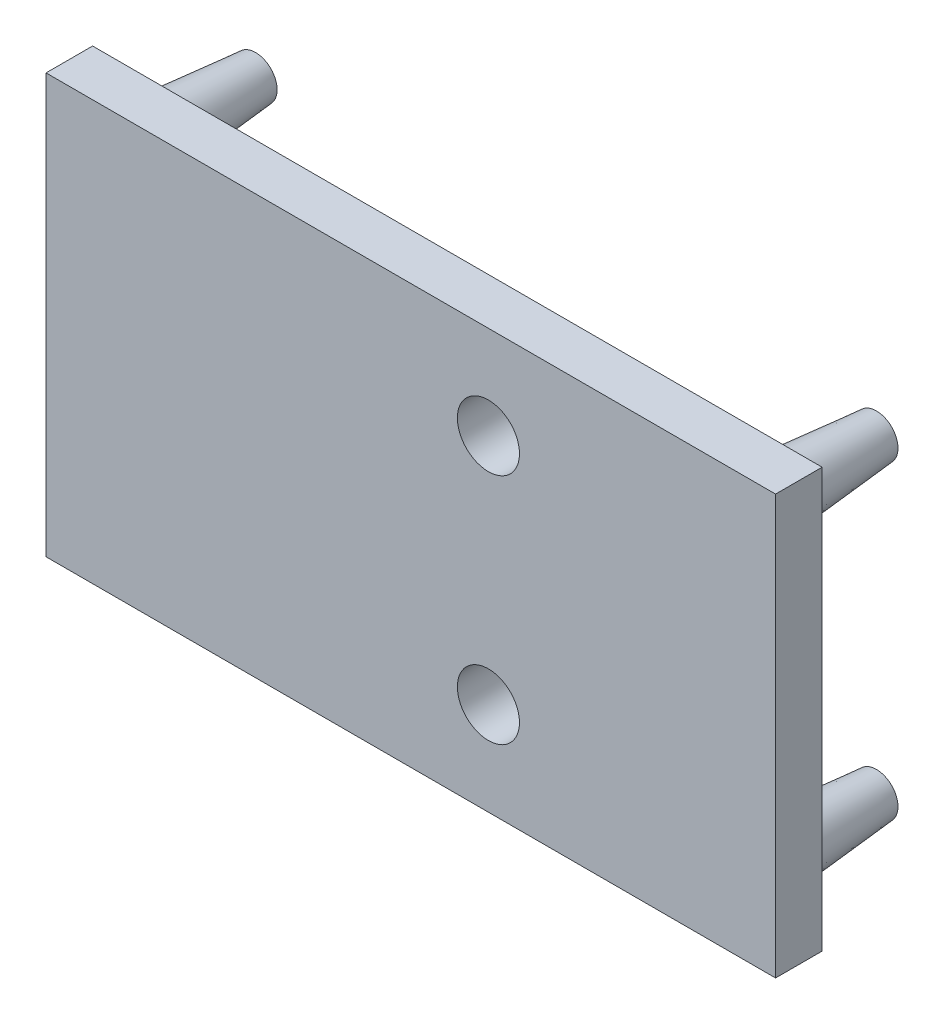
ISO-10303-21;
HEADER;
FILE_DESCRIPTION(('STEP AP214'),'2;1');
FILE_NAME('part.step','',(''),(''),'','','');
FILE_SCHEMA(('AUTOMOTIVE_DESIGN { 1 0 10303 214 1 1 1 1 }'));
ENDSEC;
DATA;
#1=APPLICATION_CONTEXT('core data for automotive mechanical design processes');
#2=APPLICATION_PROTOCOL_DEFINITION('international standard','automotive_design',2000,#1);
#3=PRODUCT_CONTEXT('',#1,'mechanical');
#4=PRODUCT('Part','Part','',(#3));
#5=PRODUCT_RELATED_PRODUCT_CATEGORY('part','',(#4));
#6=PRODUCT_DEFINITION_FORMATION('','',#4);
#7=PRODUCT_DEFINITION_CONTEXT('part definition',#1,'design');
#8=PRODUCT_DEFINITION('design','',#6,#7);
#9=PRODUCT_DEFINITION_SHAPE('','',#8);
#10=(LENGTH_UNIT() NAMED_UNIT(*) SI_UNIT(.MILLI.,.METRE.));
#11=(NAMED_UNIT(*) PLANE_ANGLE_UNIT() SI_UNIT($,.RADIAN.));
#12=(NAMED_UNIT(*) SI_UNIT($,.STERADIAN.) SOLID_ANGLE_UNIT());
#13=UNCERTAINTY_MEASURE_WITH_UNIT(LENGTH_MEASURE(1.E-05),#10,'distance_accuracy_value','');
#14=(GEOMETRIC_REPRESENTATION_CONTEXT(3) GLOBAL_UNCERTAINTY_ASSIGNED_CONTEXT((#13)) GLOBAL_UNIT_ASSIGNED_CONTEXT((#10,
#11,#12)) REPRESENTATION_CONTEXT('',''));
#15=CARTESIAN_POINT('',(0.,0.,0.));
#16=DIRECTION('',(0.,0.,1.));
#17=DIRECTION('',(1.,0.,0.));
#18=AXIS2_PLACEMENT_3D('',#15,#16,#17);
#19=CARTESIAN_POINT('',(-23.5,13.5,3.));
#20=DIRECTION('',(0.,1.,0.));
#21=DIRECTION('',(0.,0.,1.));
#22=AXIS2_PLACEMENT_3D('',#19,#20,#21);
#23=PLANE('',#22);
#24=DIRECTION('',(1.,0.,0.));
#25=VECTOR('',#24,1.);
#26=CARTESIAN_POINT('',(-23.5,13.5,0.));
#27=LINE('',#26,#25);
#28=CARTESIAN_POINT('',(-23.5,13.5,0.));
#29=VERTEX_POINT('',#28);
#30=CARTESIAN_POINT('',(23.5,13.5,0.));
#31=VERTEX_POINT('',#30);
#32=EDGE_CURVE('E107',#29,#31,#27,.T.);
#33=ORIENTED_EDGE('',*,*,#32,.F.);
#34=DIRECTION('',(0.,0.,-1.));
#35=VECTOR('',#34,1.);
#36=CARTESIAN_POINT('',(-23.5,13.5,3.));
#37=LINE('',#36,#35);
#38=CARTESIAN_POINT('',(-23.5,13.5,3.));
#39=VERTEX_POINT('',#38);
#40=EDGE_CURVE('E55',#39,#29,#37,.T.);
#41=ORIENTED_EDGE('',*,*,#40,.F.);
#42=DIRECTION('',(1.,0.,0.));
#43=VECTOR('',#42,1.);
#44=CARTESIAN_POINT('',(-23.5,13.5,3.));
#45=LINE('',#44,#43);
#46=CARTESIAN_POINT('',(23.5,13.5,3.));
#47=VERTEX_POINT('',#46);
#48=EDGE_CURVE('E100',#39,#47,#45,.T.);
#49=ORIENTED_EDGE('',*,*,#48,.T.);
#50=DIRECTION('',(0.,0.,-1.));
#51=VECTOR('',#50,1.);
#52=CARTESIAN_POINT('',(23.5,13.5,3.));
#53=LINE('',#52,#51);
#54=EDGE_CURVE('E97',#47,#31,#53,.T.);
#55=ORIENTED_EDGE('',*,*,#54,.T.);
#56=EDGE_LOOP('',(#33,#41,#49,#55));
#57=FACE_BOUND('',#56,.T.);
#58=ADVANCED_FACE('F37',(#57),#23,.T.);
#59=CARTESIAN_POINT('',(-23.5,-13.5,3.));
#60=DIRECTION('',(-1.,0.,0.));
#61=DIRECTION('',(0.,0.,1.));
#62=AXIS2_PLACEMENT_3D('',#59,#60,#61);
#63=PLANE('',#62);
#64=DIRECTION('',(0.,1.,0.));
#65=VECTOR('',#64,1.);
#66=CARTESIAN_POINT('',(-23.5,-13.5,0.));
#67=LINE('',#66,#65);
#68=CARTESIAN_POINT('',(-23.5,-13.5,0.));
#69=VERTEX_POINT('',#68);
#70=EDGE_CURVE('E102',#69,#29,#67,.T.);
#71=ORIENTED_EDGE('',*,*,#70,.F.);
#72=DIRECTION('',(0.,0.,-1.));
#73=VECTOR('',#72,1.);
#74=CARTESIAN_POINT('',(-23.5,-13.5,3.));
#75=LINE('',#74,#73);
#76=CARTESIAN_POINT('',(-23.5,-13.5,3.));
#77=VERTEX_POINT('',#76);
#78=EDGE_CURVE('E71',#77,#69,#75,.T.);
#79=ORIENTED_EDGE('',*,*,#78,.F.);
#80=DIRECTION('',(0.,1.,0.));
#81=VECTOR('',#80,1.);
#82=CARTESIAN_POINT('',(-23.5,-13.5,3.));
#83=LINE('',#82,#81);
#84=EDGE_CURVE('E88',#77,#39,#83,.T.);
#85=ORIENTED_EDGE('',*,*,#84,.T.);
#86=ORIENTED_EDGE('',*,*,#40,.T.);
#87=EDGE_LOOP('',(#71,#79,#85,#86));
#88=FACE_BOUND('',#87,.T.);
#89=ADVANCED_FACE('F164',(#88),#63,.T.);
#90=CARTESIAN_POINT('',(-23.5,-13.5,3.));
#91=DIRECTION('',(0.,1.,0.));
#92=DIRECTION('',(0.,0.,1.));
#93=AXIS2_PLACEMENT_3D('',#90,#91,#92);
#94=PLANE('',#93);
#95=DIRECTION('',(1.,0.,0.));
#96=VECTOR('',#95,1.);
#97=CARTESIAN_POINT('',(-23.5,-13.5,0.));
#98=LINE('',#97,#96);
#99=CARTESIAN_POINT('',(23.5,-13.5,0.));
#100=VERTEX_POINT('',#99);
#101=EDGE_CURVE('E93',#69,#100,#98,.T.);
#102=ORIENTED_EDGE('',*,*,#101,.T.);
#103=DIRECTION('',(0.,0.,-1.));
#104=VECTOR('',#103,1.);
#105=CARTESIAN_POINT('',(23.5,-13.5,3.));
#106=LINE('',#105,#104);
#107=CARTESIAN_POINT('',(23.5,-13.5,3.));
#108=VERTEX_POINT('',#107);
#109=EDGE_CURVE('E91',#108,#100,#106,.T.);
#110=ORIENTED_EDGE('',*,*,#109,.F.);
#111=DIRECTION('',(1.,0.,0.));
#112=VECTOR('',#111,1.);
#113=CARTESIAN_POINT('',(-23.5,-13.5,3.));
#114=LINE('',#113,#112);
#115=EDGE_CURVE('E85',#77,#108,#114,.T.);
#116=ORIENTED_EDGE('',*,*,#115,.F.);
#117=ORIENTED_EDGE('',*,*,#78,.T.);
#118=EDGE_LOOP('',(#102,#110,#116,#117));
#119=FACE_BOUND('',#118,.T.);
#120=ADVANCED_FACE('F92',(#119),#94,.F.);
#121=CARTESIAN_POINT('',(23.5,-13.5,3.));
#122=DIRECTION('',(-1.,0.,0.));
#123=DIRECTION('',(0.,0.,1.));
#124=AXIS2_PLACEMENT_3D('',#121,#122,#123);
#125=PLANE('',#124);
#126=DIRECTION('',(0.,1.,0.));
#127=VECTOR('',#126,1.);
#128=CARTESIAN_POINT('',(23.5,-13.5,0.));
#129=LINE('',#128,#127);
#130=EDGE_CURVE('E110',#100,#31,#129,.T.);
#131=ORIENTED_EDGE('',*,*,#130,.T.);
#132=ORIENTED_EDGE('',*,*,#54,.F.);
#133=DIRECTION('',(0.,1.,0.));
#134=VECTOR('',#133,1.);
#135=CARTESIAN_POINT('',(23.5,-13.5,3.));
#136=LINE('',#135,#134);
#137=EDGE_CURVE('E82',#108,#47,#136,.T.);
#138=ORIENTED_EDGE('',*,*,#137,.F.);
#139=ORIENTED_EDGE('',*,*,#109,.T.);
#140=EDGE_LOOP('',(#131,#132,#138,#139));
#141=FACE_BOUND('',#140,.T.);
#142=ADVANCED_FACE('F99',(#141),#125,.F.);
#143=CARTESIAN_POINT('',(0.,0.,3.));
#144=DIRECTION('',(0.,0.,1.));
#145=DIRECTION('',(1.,0.,0.));
#146=AXIS2_PLACEMENT_3D('',#143,#144,#145);
#147=PLANE('',#146);
#148=CARTESIAN_POINT('',(5.,7.5,3.));
#149=DIRECTION('',(0.,0.,1.));
#150=DIRECTION('',(1.,0.,0.));
#151=AXIS2_PLACEMENT_3D('',#148,#149,#150);
#152=CIRCLE('',#151,2.);
#153=CARTESIAN_POINT('',(7.,7.5,3.));
#154=VERTEX_POINT('',#153);
#155=EDGE_CURVE('E128',#154,#154,#152,.T.);
#156=ORIENTED_EDGE('',*,*,#155,.F.);
#157=EDGE_LOOP('',(#156));
#158=FACE_BOUND('',#157,.T.);
#159=CARTESIAN_POINT('',(5.,-7.5,3.));
#160=DIRECTION('',(0.,0.,1.));
#161=DIRECTION('',(1.,0.,0.));
#162=AXIS2_PLACEMENT_3D('',#159,#160,#161);
#163=CIRCLE('',#162,2.);
#164=CARTESIAN_POINT('',(7.,-7.5,3.));
#165=VERTEX_POINT('',#164);
#166=EDGE_CURVE('E134',#165,#165,#163,.T.);
#167=ORIENTED_EDGE('',*,*,#166,.F.);
#168=EDGE_LOOP('',(#167));
#169=FACE_BOUND('',#168,.T.);
#170=ORIENTED_EDGE('',*,*,#48,.F.);
#171=ORIENTED_EDGE('',*,*,#84,.F.);
#172=ORIENTED_EDGE('',*,*,#115,.T.);
#173=ORIENTED_EDGE('',*,*,#137,.T.);
#174=EDGE_LOOP('',(#170,#171,#172,#173));
#175=FACE_BOUND('',#174,.T.);
#176=ADVANCED_FACE('F87',(#158,#169,#175),#147,.T.);
#177=CARTESIAN_POINT('',(0.,0.,0.));
#178=DIRECTION('',(0.,0.,1.));
#179=DIRECTION('',(1.,0.,0.));
#180=AXIS2_PLACEMENT_3D('',#177,#178,#179);
#181=PLANE('',#180);
#182=CARTESIAN_POINT('',(5.,7.5,0.));
#183=DIRECTION('',(0.,0.,1.));
#184=DIRECTION('',(1.,0.,0.));
#185=AXIS2_PLACEMENT_3D('',#182,#183,#184);
#186=CIRCLE('',#185,2.);
#187=CARTESIAN_POINT('',(7.,7.5,0.));
#188=VERTEX_POINT('',#187);
#189=EDGE_CURVE('E40',#188,#188,#186,.T.);
#190=ORIENTED_EDGE('',*,*,#189,.T.);
#191=EDGE_LOOP('',(#190));
#192=FACE_BOUND('',#191,.T.);
#193=CARTESIAN_POINT('',(5.,-7.5,0.));
#194=DIRECTION('',(0.,0.,1.));
#195=DIRECTION('',(1.,0.,0.));
#196=AXIS2_PLACEMENT_3D('',#193,#194,#195);
#197=CIRCLE('',#196,2.);
#198=CARTESIAN_POINT('',(7.,-7.5,0.));
#199=VERTEX_POINT('',#198);
#200=EDGE_CURVE('E126',#199,#199,#197,.T.);
#201=ORIENTED_EDGE('',*,*,#200,.T.);
#202=EDGE_LOOP('',(#201));
#203=FACE_BOUND('',#202,.T.);
#204=CARTESIAN_POINT('',(-20.,10.,0.));
#205=DIRECTION('',(0.,0.,1.));
#206=DIRECTION('',(1.,0.,0.));
#207=AXIS2_PLACEMENT_3D('',#204,#205,#206);
#208=CIRCLE('',#207,2.);
#209=CARTESIAN_POINT('',(-18.,10.,0.));
#210=VERTEX_POINT('',#209);
#211=EDGE_CURVE('E11',#210,#210,#208,.F.);
#212=ORIENTED_EDGE('',*,*,#211,.F.);
#213=EDGE_LOOP('',(#212));
#214=FACE_BOUND('',#213,.T.);
#215=CARTESIAN_POINT('',(-20.,-10.,0.));
#216=DIRECTION('',(0.,0.,1.));
#217=DIRECTION('',(1.,0.,0.));
#218=AXIS2_PLACEMENT_3D('',#215,#216,#217);
#219=CIRCLE('',#218,2.);
#220=CARTESIAN_POINT('',(-18.,-10.,0.));
#221=VERTEX_POINT('',#220);
#222=EDGE_CURVE('E46',#221,#221,#219,.F.);
#223=ORIENTED_EDGE('',*,*,#222,.F.);
#224=EDGE_LOOP('',(#223));
#225=FACE_BOUND('',#224,.T.);
#226=CARTESIAN_POINT('',(20.,-10.,0.));
#227=DIRECTION('',(0.,0.,1.));
#228=DIRECTION('',(1.,0.,0.));
#229=AXIS2_PLACEMENT_3D('',#226,#227,#228);
#230=CIRCLE('',#229,2.);
#231=CARTESIAN_POINT('',(22.,-10.,0.));
#232=VERTEX_POINT('',#231);
#233=EDGE_CURVE('E122',#232,#232,#230,.F.);
#234=ORIENTED_EDGE('',*,*,#233,.F.);
#235=EDGE_LOOP('',(#234));
#236=FACE_BOUND('',#235,.T.);
#237=CARTESIAN_POINT('',(20.,10.,0.));
#238=DIRECTION('',(0.,0.,1.));
#239=DIRECTION('',(1.,0.,0.));
#240=AXIS2_PLACEMENT_3D('',#237,#238,#239);
#241=CIRCLE('',#240,2.);
#242=CARTESIAN_POINT('',(22.,10.,0.));
#243=VERTEX_POINT('',#242);
#244=EDGE_CURVE('E117',#243,#243,#241,.F.);
#245=ORIENTED_EDGE('',*,*,#244,.F.);
#246=EDGE_LOOP('',(#245));
#247=FACE_BOUND('',#246,.T.);
#248=ORIENTED_EDGE('',*,*,#32,.T.);
#249=ORIENTED_EDGE('',*,*,#130,.F.);
#250=ORIENTED_EDGE('',*,*,#101,.F.);
#251=ORIENTED_EDGE('',*,*,#70,.T.);
#252=EDGE_LOOP('',(#248,#249,#250,#251));
#253=FACE_BOUND('',#252,.T.);
#254=ADVANCED_FACE('F156',(#192,#203,#214,#225,#236,#247,#253),#181,.F.);
#255=CARTESIAN_POINT('',(20.,10.,0.));
#256=DIRECTION('',(0.,0.,1.));
#257=DIRECTION('',(-1.,0.,0.));
#258=AXIS2_PLACEMENT_3D('',#255,#256,#257);
#259=CONICAL_SURFACE('',#258,2.,0.0872664625997167);
#260=CARTESIAN_POINT('',(20.,10.,-7.));
#261=DIRECTION('',(0.,0.,-1.));
#262=DIRECTION('',(-1.,0.,0.));
#263=AXIS2_PLACEMENT_3D('',#260,#261,#262);
#264=CIRCLE('',#263,1.38757935531853);
#265=CARTESIAN_POINT('',(18.6124206446815,10.,-7.));
#266=VERTEX_POINT('',#265);
#267=EDGE_CURVE('E111',#266,#266,#264,.T.);
#268=ORIENTED_EDGE('',*,*,#267,.F.);
#269=EDGE_LOOP('',(#268));
#270=FACE_BOUND('',#269,.T.);
#271=ORIENTED_EDGE('',*,*,#244,.T.);
#272=EDGE_LOOP('',(#271));
#273=FACE_BOUND('',#272,.T.);
#274=ADVANCED_FACE('F153',(#270,#273),#259,.T.);
#275=CARTESIAN_POINT('',(20.,10.,-7.));
#276=DIRECTION('',(0.,0.,-1.));
#277=DIRECTION('',(-1.,0.,0.));
#278=AXIS2_PLACEMENT_3D('',#275,#276,#277);
#279=PLANE('',#278);
#280=ORIENTED_EDGE('',*,*,#267,.T.);
#281=EDGE_LOOP('',(#280));
#282=FACE_BOUND('',#281,.T.);
#283=ADVANCED_FACE('F151',(#282),#279,.T.);
#284=CARTESIAN_POINT('',(20.,-10.,0.));
#285=DIRECTION('',(0.,0.,1.));
#286=DIRECTION('',(-1.,0.,0.));
#287=AXIS2_PLACEMENT_3D('',#284,#285,#286);
#288=CONICAL_SURFACE('',#287,2.,0.0872664625997167);
#289=CARTESIAN_POINT('',(20.,-10.,-7.));
#290=DIRECTION('',(0.,0.,-1.));
#291=DIRECTION('',(-1.,0.,0.));
#292=AXIS2_PLACEMENT_3D('',#289,#290,#291);
#293=CIRCLE('',#292,1.38757935531853);
#294=CARTESIAN_POINT('',(18.6124206446815,-10.,-7.));
#295=VERTEX_POINT('',#294);
#296=EDGE_CURVE('E146',#295,#295,#293,.T.);
#297=ORIENTED_EDGE('',*,*,#296,.F.);
#298=EDGE_LOOP('',(#297));
#299=FACE_BOUND('',#298,.T.);
#300=ORIENTED_EDGE('',*,*,#233,.T.);
#301=EDGE_LOOP('',(#300));
#302=FACE_BOUND('',#301,.T.);
#303=ADVANCED_FACE('F184',(#299,#302),#288,.T.);
#304=CARTESIAN_POINT('',(20.,-10.,-7.));
#305=DIRECTION('',(0.,0.,-1.));
#306=DIRECTION('',(-1.,0.,0.));
#307=AXIS2_PLACEMENT_3D('',#304,#305,#306);
#308=PLANE('',#307);
#309=ORIENTED_EDGE('',*,*,#296,.T.);
#310=EDGE_LOOP('',(#309));
#311=FACE_BOUND('',#310,.T.);
#312=ADVANCED_FACE('F185',(#311),#308,.T.);
#313=CARTESIAN_POINT('',(-20.,-10.,0.));
#314=DIRECTION('',(0.,0.,1.));
#315=DIRECTION('',(-1.,0.,0.));
#316=AXIS2_PLACEMENT_3D('',#313,#314,#315);
#317=CONICAL_SURFACE('',#316,2.,0.0872664625997167);
#318=CARTESIAN_POINT('',(-20.,-10.,-7.));
#319=DIRECTION('',(0.,0.,-1.));
#320=DIRECTION('',(-1.,0.,0.));
#321=AXIS2_PLACEMENT_3D('',#318,#319,#320);
#322=CIRCLE('',#321,1.38757935531853);
#323=CARTESIAN_POINT('',(-21.3875793553185,-10.,-7.));
#324=VERTEX_POINT('',#323);
#325=EDGE_CURVE('E143',#324,#324,#322,.T.);
#326=ORIENTED_EDGE('',*,*,#325,.F.);
#327=EDGE_LOOP('',(#326));
#328=FACE_BOUND('',#327,.T.);
#329=ORIENTED_EDGE('',*,*,#222,.T.);
#330=EDGE_LOOP('',(#329));
#331=FACE_BOUND('',#330,.T.);
#332=ADVANCED_FACE('F188',(#328,#331),#317,.T.);
#333=CARTESIAN_POINT('',(-20.,-10.,-7.));
#334=DIRECTION('',(0.,0.,-1.));
#335=DIRECTION('',(-1.,0.,0.));
#336=AXIS2_PLACEMENT_3D('',#333,#334,#335);
#337=PLANE('',#336);
#338=ORIENTED_EDGE('',*,*,#325,.T.);
#339=EDGE_LOOP('',(#338));
#340=FACE_BOUND('',#339,.T.);
#341=ADVANCED_FACE('F193',(#340),#337,.T.);
#342=CARTESIAN_POINT('',(-20.,10.,0.));
#343=DIRECTION('',(0.,0.,1.));
#344=DIRECTION('',(-1.,0.,0.));
#345=AXIS2_PLACEMENT_3D('',#342,#343,#344);
#346=CONICAL_SURFACE('',#345,2.,0.0872664625997167);
#347=CARTESIAN_POINT('',(-20.,10.,-7.));
#348=DIRECTION('',(0.,0.,-1.));
#349=DIRECTION('',(-1.,0.,0.));
#350=AXIS2_PLACEMENT_3D('',#347,#348,#349);
#351=CIRCLE('',#350,1.38757935531853);
#352=CARTESIAN_POINT('',(-21.3875793553185,10.,-7.));
#353=VERTEX_POINT('',#352);
#354=EDGE_CURVE('E132',#353,#353,#351,.T.);
#355=ORIENTED_EDGE('',*,*,#354,.F.);
#356=EDGE_LOOP('',(#355));
#357=FACE_BOUND('',#356,.T.);
#358=ORIENTED_EDGE('',*,*,#211,.T.);
#359=EDGE_LOOP('',(#358));
#360=FACE_BOUND('',#359,.T.);
#361=ADVANCED_FACE('F196',(#357,#360),#346,.T.);
#362=CARTESIAN_POINT('',(-20.,10.,-7.));
#363=DIRECTION('',(0.,0.,-1.));
#364=DIRECTION('',(-1.,0.,0.));
#365=AXIS2_PLACEMENT_3D('',#362,#363,#364);
#366=PLANE('',#365);
#367=ORIENTED_EDGE('',*,*,#354,.T.);
#368=EDGE_LOOP('',(#367));
#369=FACE_BOUND('',#368,.T.);
#370=ADVANCED_FACE('F201',(#369),#366,.T.);
#371=CARTESIAN_POINT('',(5.,-7.5,-2.));
#372=DIRECTION('',(0.,0.,1.));
#373=DIRECTION('',(1.,0.,0.));
#374=AXIS2_PLACEMENT_3D('',#371,#372,#373);
#375=CYLINDRICAL_SURFACE('',#374,2.);
#376=ORIENTED_EDGE('',*,*,#166,.T.);
#377=EDGE_LOOP('',(#376));
#378=FACE_BOUND('',#377,.T.);
#379=ORIENTED_EDGE('',*,*,#200,.F.);
#380=EDGE_LOOP('',(#379));
#381=FACE_BOUND('',#380,.T.);
#382=ADVANCED_FACE('F204',(#378,#381),#375,.F.);
#383=CARTESIAN_POINT('',(5.,7.5,-2.));
#384=DIRECTION('',(0.,0.,1.));
#385=DIRECTION('',(1.,0.,0.));
#386=AXIS2_PLACEMENT_3D('',#383,#384,#385);
#387=CYLINDRICAL_SURFACE('',#386,2.);
#388=ORIENTED_EDGE('',*,*,#155,.T.);
#389=EDGE_LOOP('',(#388));
#390=FACE_BOUND('',#389,.T.);
#391=ORIENTED_EDGE('',*,*,#189,.F.);
#392=EDGE_LOOP('',(#391));
#393=FACE_BOUND('',#392,.T.);
#394=ADVANCED_FACE('F211',(#390,#393),#387,.F.);
#395=CLOSED_SHELL('',(#58,#89,#120,#142,#176,#254,#274,#283,#303,#312,#332,#341,#361,#370,#382,#394));
#396=MANIFOLD_SOLID_BREP('B2',#395);
#397=ADVANCED_BREP_SHAPE_REPRESENTATION('',(#18,#396),#14);
#398=SHAPE_DEFINITION_REPRESENTATION(#9,#397);
ENDSEC;
END-ISO-10303-21;
